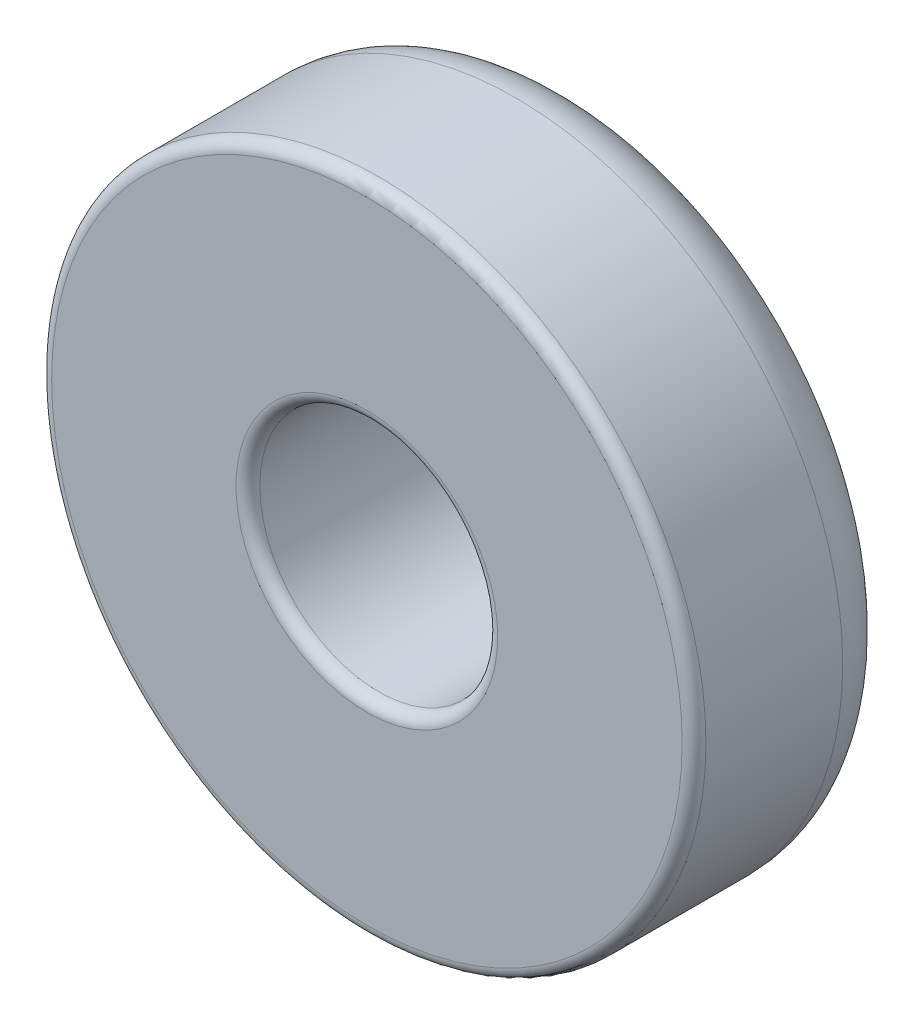
ISO-10303-21;
HEADER;
FILE_DESCRIPTION(('STEP AP214'),'2;1');
FILE_NAME('part.step','',(''),(''),'','','');
FILE_SCHEMA(('AUTOMOTIVE_DESIGN { 1 0 10303 214 1 1 1 1 }'));
ENDSEC;
DATA;
#1=APPLICATION_CONTEXT('core data for automotive mechanical design processes');
#2=APPLICATION_PROTOCOL_DEFINITION('international standard','automotive_design',2000,#1);
#3=PRODUCT_CONTEXT('',#1,'mechanical');
#4=PRODUCT('Part','Part','',(#3));
#5=PRODUCT_RELATED_PRODUCT_CATEGORY('part','',(#4));
#6=PRODUCT_DEFINITION_FORMATION('','',#4);
#7=PRODUCT_DEFINITION_CONTEXT('part definition',#1,'design');
#8=PRODUCT_DEFINITION('design','',#6,#7);
#9=PRODUCT_DEFINITION_SHAPE('','',#8);
#10=(LENGTH_UNIT() NAMED_UNIT(*) SI_UNIT(.MILLI.,.METRE.));
#11=(NAMED_UNIT(*) PLANE_ANGLE_UNIT() SI_UNIT($,.RADIAN.));
#12=(NAMED_UNIT(*) SI_UNIT($,.STERADIAN.) SOLID_ANGLE_UNIT());
#13=UNCERTAINTY_MEASURE_WITH_UNIT(LENGTH_MEASURE(1.E-05),#10,'distance_accuracy_value','');
#14=(GEOMETRIC_REPRESENTATION_CONTEXT(3) GLOBAL_UNCERTAINTY_ASSIGNED_CONTEXT((#13)) GLOBAL_UNIT_ASSIGNED_CONTEXT((#10,
#11,#12)) REPRESENTATION_CONTEXT('',''));
#15=CARTESIAN_POINT('',(0.,0.,0.));
#16=DIRECTION('',(0.,0.,1.));
#17=DIRECTION('',(1.,0.,0.));
#18=AXIS2_PLACEMENT_3D('',#15,#16,#17);
#19=CARTESIAN_POINT('',(0.,0.,1.75));
#20=DIRECTION('',(0.,0.,1.));
#21=DIRECTION('',(1.,0.,0.));
#22=AXIS2_PLACEMENT_3D('',#19,#20,#21);
#23=PLANE('',#22);
#24=CARTESIAN_POINT('',(0.,0.,1.75));
#25=DIRECTION('',(0.,0.,1.));
#26=DIRECTION('',(1.,0.,0.));
#27=AXIS2_PLACEMENT_3D('',#24,#25,#26);
#28=CIRCLE('',#27,1.1);
#29=CARTESIAN_POINT('',(1.1,0.,1.75));
#30=VERTEX_POINT('',#29);
#31=EDGE_CURVE('E43',#30,#30,#28,.F.);
#32=ORIENTED_EDGE('',*,*,#31,.T.);
#33=EDGE_LOOP('',(#32));
#34=FACE_BOUND('',#33,.T.);
#35=CARTESIAN_POINT('',(0.,0.,1.75));
#36=DIRECTION('',(0.,0.,1.));
#37=DIRECTION('',(1.,0.,0.));
#38=AXIS2_PLACEMENT_3D('',#35,#36,#37);
#39=CIRCLE('',#38,2.65);
#40=CARTESIAN_POINT('',(2.65,0.,1.75));
#41=VERTEX_POINT('',#40);
#42=EDGE_CURVE('E47',#41,#41,#39,.T.);
#43=ORIENTED_EDGE('',*,*,#42,.T.);
#44=EDGE_LOOP('',(#43));
#45=FACE_BOUND('',#44,.T.);
#46=ADVANCED_FACE('F36',(#34,#45),#23,.T.);
#47=CARTESIAN_POINT('',(0.,0.,0.));
#48=DIRECTION('',(0.,0.,1.));
#49=DIRECTION('',(1.,0.,0.));
#50=AXIS2_PLACEMENT_3D('',#47,#48,#49);
#51=PLANE('',#50);
#52=CARTESIAN_POINT('',(0.,0.,0.));
#53=DIRECTION('',(0.,0.,1.));
#54=DIRECTION('',(1.,0.,0.));
#55=AXIS2_PLACEMENT_3D('',#52,#53,#54);
#56=CIRCLE('',#55,1.1);
#57=CARTESIAN_POINT('',(1.1,0.,0.));
#58=VERTEX_POINT('',#57);
#59=EDGE_CURVE('E59',#58,#58,#56,.T.);
#60=ORIENTED_EDGE('',*,*,#59,.T.);
#61=EDGE_LOOP('',(#60));
#62=FACE_BOUND('',#61,.T.);
#63=CARTESIAN_POINT('',(0.,0.,0.));
#64=DIRECTION('',(0.,0.,1.));
#65=DIRECTION('',(1.,0.,0.));
#66=AXIS2_PLACEMENT_3D('',#63,#64,#65);
#67=CIRCLE('',#66,2.25);
#68=CARTESIAN_POINT('',(2.25,0.,0.));
#69=VERTEX_POINT('',#68);
#70=EDGE_CURVE('E62',#69,#69,#67,.F.);
#71=ORIENTED_EDGE('',*,*,#70,.T.);
#72=EDGE_LOOP('',(#71));
#73=FACE_BOUND('',#72,.T.);
#74=ADVANCED_FACE('F89',(#62,#73),#51,.F.);
#75=CARTESIAN_POINT('',(0.,0.,1.75));
#76=DIRECTION('',(0.,0.,-1.));
#77=DIRECTION('',(-1.,0.,0.));
#78=AXIS2_PLACEMENT_3D('',#75,#76,#77);
#79=CYLINDRICAL_SURFACE('',#78,2.75);
#80=CARTESIAN_POINT('',(0.,0.,1.65));
#81=DIRECTION('',(0.,0.,1.));
#82=DIRECTION('',(1.,0.,0.));
#83=AXIS2_PLACEMENT_3D('',#80,#81,#82);
#84=CIRCLE('',#83,2.75);
#85=CARTESIAN_POINT('',(2.75,0.,1.65));
#86=VERTEX_POINT('',#85);
#87=EDGE_CURVE('E11',#86,#86,#84,.F.);
#88=ORIENTED_EDGE('',*,*,#87,.T.);
#89=EDGE_LOOP('',(#88));
#90=FACE_BOUND('',#89,.T.);
#91=CARTESIAN_POINT('',(0.,0.,0.5));
#92=DIRECTION('',(0.,0.,1.));
#93=DIRECTION('',(1.,0.,0.));
#94=AXIS2_PLACEMENT_3D('',#91,#92,#93);
#95=CIRCLE('',#94,2.75);
#96=CARTESIAN_POINT('',(2.75,0.,0.5));
#97=VERTEX_POINT('',#96);
#98=EDGE_CURVE('E65',#97,#97,#95,.T.);
#99=ORIENTED_EDGE('',*,*,#98,.T.);
#100=EDGE_LOOP('',(#99));
#101=FACE_BOUND('',#100,.T.);
#102=ADVANCED_FACE('F69',(#90,#101),#79,.T.);
#103=CARTESIAN_POINT('',(0.,0.,1.75));
#104=DIRECTION('',(0.,0.,-1.));
#105=DIRECTION('',(-1.,0.,0.));
#106=AXIS2_PLACEMENT_3D('',#103,#104,#105);
#107=CYLINDRICAL_SURFACE('',#106,1.);
#108=CARTESIAN_POINT('',(0.,0.,0.1));
#109=DIRECTION('',(0.,0.,1.));
#110=DIRECTION('',(1.,0.,0.));
#111=AXIS2_PLACEMENT_3D('',#108,#109,#110);
#112=CIRCLE('',#111,1.);
#113=CARTESIAN_POINT('',(1.,0.,0.1));
#114=VERTEX_POINT('',#113);
#115=EDGE_CURVE('E51',#114,#114,#112,.F.);
#116=ORIENTED_EDGE('',*,*,#115,.T.);
#117=EDGE_LOOP('',(#116));
#118=FACE_BOUND('',#117,.T.);
#119=CARTESIAN_POINT('',(0.,0.,1.65));
#120=DIRECTION('',(0.,0.,1.));
#121=DIRECTION('',(1.,0.,0.));
#122=AXIS2_PLACEMENT_3D('',#119,#120,#121);
#123=CIRCLE('',#122,1.);
#124=CARTESIAN_POINT('',(1.,0.,1.65));
#125=VERTEX_POINT('',#124);
#126=EDGE_CURVE('E56',#125,#125,#123,.T.);
#127=ORIENTED_EDGE('',*,*,#126,.T.);
#128=EDGE_LOOP('',(#127));
#129=FACE_BOUND('',#128,.T.);
#130=ADVANCED_FACE('F74',(#118,#129),#107,.F.);
#131=CARTESIAN_POINT('',(0.,0.,0.5));
#132=DIRECTION('',(0.,0.,1.));
#133=DIRECTION('',(1.,0.,0.));
#134=AXIS2_PLACEMENT_3D('',#131,#132,#133);
#135=TOROIDAL_SURFACE('',#134,2.25,0.5);
#136=ORIENTED_EDGE('',*,*,#70,.F.);
#137=EDGE_LOOP('',(#136));
#138=FACE_BOUND('',#137,.T.);
#139=ORIENTED_EDGE('',*,*,#98,.F.);
#140=EDGE_LOOP('',(#139));
#141=FACE_BOUND('',#140,.T.);
#142=ADVANCED_FACE('F71',(#138,#141),#135,.T.);
#143=CARTESIAN_POINT('',(0.,0.,0.1));
#144=DIRECTION('',(0.,0.,1.));
#145=DIRECTION('',(1.,0.,0.));
#146=AXIS2_PLACEMENT_3D('',#143,#144,#145);
#147=TOROIDAL_SURFACE('',#146,1.1,0.1);
#148=ORIENTED_EDGE('',*,*,#115,.F.);
#149=EDGE_LOOP('',(#148));
#150=FACE_BOUND('',#149,.T.);
#151=ORIENTED_EDGE('',*,*,#59,.F.);
#152=EDGE_LOOP('',(#151));
#153=FACE_BOUND('',#152,.T.);
#154=ADVANCED_FACE('F73',(#150,#153),#147,.T.);
#155=CARTESIAN_POINT('',(0.,0.,1.65));
#156=DIRECTION('',(0.,0.,1.));
#157=DIRECTION('',(1.,0.,0.));
#158=AXIS2_PLACEMENT_3D('',#155,#156,#157);
#159=TOROIDAL_SURFACE('',#158,1.1,0.1);
#160=ORIENTED_EDGE('',*,*,#31,.F.);
#161=EDGE_LOOP('',(#160));
#162=FACE_BOUND('',#161,.T.);
#163=ORIENTED_EDGE('',*,*,#126,.F.);
#164=EDGE_LOOP('',(#163));
#165=FACE_BOUND('',#164,.T.);
#166=ADVANCED_FACE('F81',(#162,#165),#159,.T.);
#167=CARTESIAN_POINT('',(0.,0.,1.65));
#168=DIRECTION('',(0.,0.,1.));
#169=DIRECTION('',(1.,0.,0.));
#170=AXIS2_PLACEMENT_3D('',#167,#168,#169);
#171=TOROIDAL_SURFACE('',#170,2.65,0.1);
#172=ORIENTED_EDGE('',*,*,#87,.F.);
#173=EDGE_LOOP('',(#172));
#174=FACE_BOUND('',#173,.T.);
#175=ORIENTED_EDGE('',*,*,#42,.F.);
#176=EDGE_LOOP('',(#175));
#177=FACE_BOUND('',#176,.T.);
#178=ADVANCED_FACE('F38',(#174,#177),#171,.T.);
#179=CLOSED_SHELL('',(#46,#74,#102,#130,#142,#154,#166,#178));
#180=MANIFOLD_SOLID_BREP('B2',#179);
#181=ADVANCED_BREP_SHAPE_REPRESENTATION('',(#18,#180),#14);
#182=SHAPE_DEFINITION_REPRESENTATION(#9,#181);
ENDSEC;
END-ISO-10303-21;
